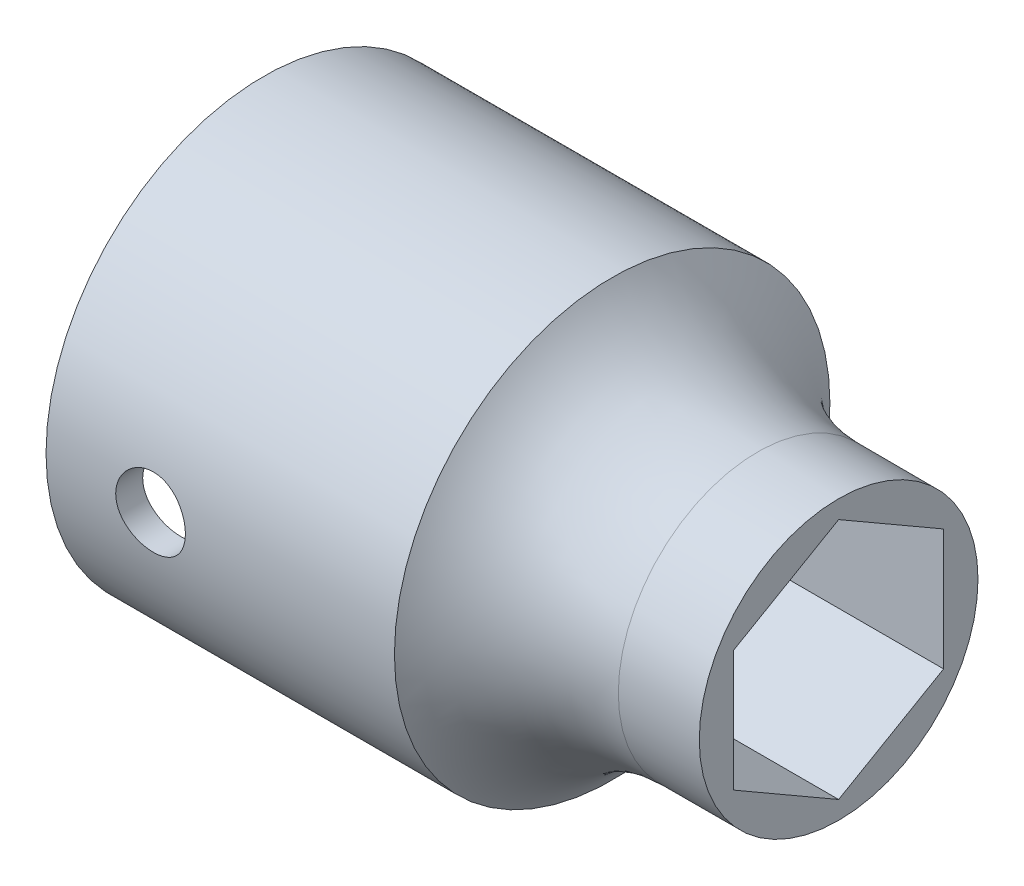
ISO-10303-21;
HEADER;
FILE_DESCRIPTION(('STEP AP214'),'2;1');
FILE_NAME('part.step','',(''),(''),'','','');
FILE_SCHEMA(('AUTOMOTIVE_DESIGN { 1 0 10303 214 1 1 1 1 }'));
ENDSEC;
DATA;
#1=APPLICATION_CONTEXT('core data for automotive mechanical design processes');
#2=APPLICATION_PROTOCOL_DEFINITION('international standard','automotive_design',2000,#1);
#3=PRODUCT_CONTEXT('',#1,'mechanical');
#4=PRODUCT('Part','Part','',(#3));
#5=PRODUCT_RELATED_PRODUCT_CATEGORY('part','',(#4));
#6=PRODUCT_DEFINITION_FORMATION('','',#4);
#7=PRODUCT_DEFINITION_CONTEXT('part definition',#1,'design');
#8=PRODUCT_DEFINITION('design','',#6,#7);
#9=PRODUCT_DEFINITION_SHAPE('','',#8);
#10=(LENGTH_UNIT() NAMED_UNIT(*) SI_UNIT(.MILLI.,.METRE.));
#11=(NAMED_UNIT(*) PLANE_ANGLE_UNIT() SI_UNIT($,.RADIAN.));
#12=(NAMED_UNIT(*) SI_UNIT($,.STERADIAN.) SOLID_ANGLE_UNIT());
#13=UNCERTAINTY_MEASURE_WITH_UNIT(LENGTH_MEASURE(1.E-05),#10,'distance_accuracy_value','');
#14=(GEOMETRIC_REPRESENTATION_CONTEXT(3) GLOBAL_UNCERTAINTY_ASSIGNED_CONTEXT((#13)) GLOBAL_UNIT_ASSIGNED_CONTEXT((#10,
#11,#12)) REPRESENTATION_CONTEXT('',''));
#15=CARTESIAN_POINT('',(0.,0.,0.));
#16=DIRECTION('',(0.,0.,1.));
#17=DIRECTION('',(1.,0.,0.));
#18=AXIS2_PLACEMENT_3D('',#15,#16,#17);
#19=CARTESIAN_POINT('',(30.,0.,0.));
#20=DIRECTION('',(-1.,0.,0.));
#21=DIRECTION('',(0.,0.,1.));
#22=AXIS2_PLACEMENT_3D('',#19,#20,#21);
#23=CYLINDRICAL_SURFACE('',#22,8.);
#24=CARTESIAN_POINT('',(28.351646544245,0.,0.));
#25=DIRECTION('',(-1.,0.,0.));
#26=DIRECTION('',(0.,0.,1.));
#27=AXIS2_PLACEMENT_3D('',#24,#25,#26);
#28=CIRCLE('',#27,8.);
#29=CARTESIAN_POINT('',(28.351646544245,0.,8.));
#30=VERTEX_POINT('',#29);
#31=EDGE_CURVE('E12',#30,#30,#28,.F.);
#32=ORIENTED_EDGE('',*,*,#31,.T.);
#33=EDGE_LOOP('',(#32));
#34=FACE_BOUND('',#33,.T.);
#35=CARTESIAN_POINT('',(33.,0.,0.));
#36=DIRECTION('',(1.,0.,0.));
#37=DIRECTION('',(0.,0.,-1.));
#38=AXIS2_PLACEMENT_3D('',#35,#36,#37);
#39=CIRCLE('',#38,8.);
#40=CARTESIAN_POINT('',(33.,0.,-8.));
#41=VERTEX_POINT('',#40);
#42=EDGE_CURVE('E122',#41,#41,#39,.T.);
#43=ORIENTED_EDGE('',*,*,#42,.F.);
#44=EDGE_LOOP('',(#43));
#45=FACE_BOUND('',#44,.T.);
#46=ADVANCED_FACE('F40',(#34,#45),#23,.T.);
#47=CARTESIAN_POINT('',(21.5,-3.4785353718675,6.025));
#48=DIRECTION('',(0.,-0.866025403784439,0.5));
#49=DIRECTION('',(0.,-0.5,-0.866025403784439));
#50=AXIS2_PLACEMENT_3D('',#47,#48,#49);
#51=PLANE('',#50);
#52=DIRECTION('',(1.,0.,0.));
#53=VECTOR('',#52,1.);
#54=CARTESIAN_POINT('',(21.5,-3.4785353718675,6.025));
#55=LINE('',#54,#53);
#56=CARTESIAN_POINT('',(21.5,-3.4785353718675,6.025));
#57=VERTEX_POINT('',#56);
#58=CARTESIAN_POINT('',(33.,-3.4785353718675,6.025));
#59=VERTEX_POINT('',#58);
#60=EDGE_CURVE('E48',#57,#59,#55,.T.);
#61=ORIENTED_EDGE('',*,*,#60,.T.);
#62=DIRECTION('',(0.,-0.5,-0.866025403784439));
#63=VECTOR('',#62,1.);
#64=CARTESIAN_POINT('',(33.,-3.4785353718675,6.025));
#65=LINE('',#64,#63);
#66=CARTESIAN_POINT('',(33.,-6.95707074373499,0.));
#67=VERTEX_POINT('',#66);
#68=EDGE_CURVE('E95',#59,#67,#65,.T.);
#69=ORIENTED_EDGE('',*,*,#68,.T.);
#70=DIRECTION('',(1.,0.,0.));
#71=VECTOR('',#70,1.);
#72=CARTESIAN_POINT('',(21.5,-6.95707074373499,0.));
#73=LINE('',#72,#71);
#74=CARTESIAN_POINT('',(21.5,-6.95707074373499,0.));
#75=VERTEX_POINT('',#74);
#76=EDGE_CURVE('E240',#75,#67,#73,.T.);
#77=ORIENTED_EDGE('',*,*,#76,.F.);
#78=DIRECTION('',(0.,-0.5,-0.866025403784439));
#79=VECTOR('',#78,1.);
#80=CARTESIAN_POINT('',(21.5,-3.4785353718675,6.025));
#81=LINE('',#80,#79);
#82=EDGE_CURVE('E98',#57,#75,#81,.T.);
#83=ORIENTED_EDGE('',*,*,#82,.F.);
#84=EDGE_LOOP('',(#61,#69,#77,#83));
#85=FACE_BOUND('',#84,.T.);
#86=ADVANCED_FACE('F93',(#85),#51,.F.);
#87=CARTESIAN_POINT('',(21.5,3.4785353718675,6.025));
#88=DIRECTION('',(0.,0.,1.));
#89=DIRECTION('',(0.,-1.,0.));
#90=AXIS2_PLACEMENT_3D('',#87,#88,#89);
#91=PLANE('',#90);
#92=DIRECTION('',(1.,0.,0.));
#93=VECTOR('',#92,1.);
#94=CARTESIAN_POINT('',(21.5,3.4785353718675,6.025));
#95=LINE('',#94,#93);
#96=CARTESIAN_POINT('',(21.5,3.4785353718675,6.025));
#97=VERTEX_POINT('',#96);
#98=CARTESIAN_POINT('',(33.,3.4785353718675,6.025));
#99=VERTEX_POINT('',#98);
#100=EDGE_CURVE('E62',#97,#99,#95,.T.);
#101=ORIENTED_EDGE('',*,*,#100,.T.);
#102=DIRECTION('',(0.,-1.,0.));
#103=VECTOR('',#102,1.);
#104=CARTESIAN_POINT('',(33.,3.4785353718675,6.025));
#105=LINE('',#104,#103);
#106=EDGE_CURVE('E102',#99,#59,#105,.T.);
#107=ORIENTED_EDGE('',*,*,#106,.T.);
#108=ORIENTED_EDGE('',*,*,#60,.F.);
#109=DIRECTION('',(0.,-1.,0.));
#110=VECTOR('',#109,1.);
#111=CARTESIAN_POINT('',(21.5,3.4785353718675,6.025));
#112=LINE('',#111,#110);
#113=EDGE_CURVE('E224',#97,#57,#112,.T.);
#114=ORIENTED_EDGE('',*,*,#113,.F.);
#115=EDGE_LOOP('',(#101,#107,#108,#114));
#116=FACE_BOUND('',#115,.T.);
#117=ADVANCED_FACE('F103',(#116),#91,.F.);
#118=CARTESIAN_POINT('',(21.5,6.95707074373499,0.));
#119=DIRECTION('',(0.,0.866025403784439,0.5));
#120=DIRECTION('',(0.,-0.5,0.866025403784439));
#121=AXIS2_PLACEMENT_3D('',#118,#119,#120);
#122=PLANE('',#121);
#123=DIRECTION('',(1.,0.,0.));
#124=VECTOR('',#123,1.);
#125=CARTESIAN_POINT('',(21.5,6.95707074373499,0.));
#126=LINE('',#125,#124);
#127=CARTESIAN_POINT('',(21.5,6.95707074373499,0.));
#128=VERTEX_POINT('',#127);
#129=CARTESIAN_POINT('',(33.,6.95707074373499,0.));
#130=VERTEX_POINT('',#129);
#131=EDGE_CURVE('E243',#128,#130,#126,.T.);
#132=ORIENTED_EDGE('',*,*,#131,.T.);
#133=DIRECTION('',(0.,-0.5,0.866025403784439));
#134=VECTOR('',#133,1.);
#135=CARTESIAN_POINT('',(33.,6.95707074373499,0.));
#136=LINE('',#135,#134);
#137=EDGE_CURVE('E120',#130,#99,#136,.T.);
#138=ORIENTED_EDGE('',*,*,#137,.T.);
#139=ORIENTED_EDGE('',*,*,#100,.F.);
#140=DIRECTION('',(0.,-0.5,0.866025403784439));
#141=VECTOR('',#140,1.);
#142=CARTESIAN_POINT('',(21.5,6.95707074373499,0.));
#143=LINE('',#142,#141);
#144=EDGE_CURVE('E238',#128,#97,#143,.T.);
#145=ORIENTED_EDGE('',*,*,#144,.F.);
#146=EDGE_LOOP('',(#132,#138,#139,#145));
#147=FACE_BOUND('',#146,.T.);
#148=ADVANCED_FACE('F206',(#147),#122,.F.);
#149=CARTESIAN_POINT('',(21.5,3.4785353718675,-6.025));
#150=DIRECTION('',(0.,0.866025403784439,-0.5));
#151=DIRECTION('',(0.,0.5,0.866025403784439));
#152=AXIS2_PLACEMENT_3D('',#149,#150,#151);
#153=PLANE('',#152);
#154=DIRECTION('',(1.,0.,0.));
#155=VECTOR('',#154,1.);
#156=CARTESIAN_POINT('',(21.5,3.4785353718675,-6.025));
#157=LINE('',#156,#155);
#158=CARTESIAN_POINT('',(21.5,3.4785353718675,-6.025));
#159=VERTEX_POINT('',#158);
#160=CARTESIAN_POINT('',(33.,3.4785353718675,-6.025));
#161=VERTEX_POINT('',#160);
#162=EDGE_CURVE('E245',#159,#161,#157,.T.);
#163=ORIENTED_EDGE('',*,*,#162,.T.);
#164=DIRECTION('',(0.,0.5,0.866025403784439));
#165=VECTOR('',#164,1.);
#166=CARTESIAN_POINT('',(33.,3.4785353718675,-6.025));
#167=LINE('',#166,#165);
#168=EDGE_CURVE('E117',#161,#130,#167,.T.);
#169=ORIENTED_EDGE('',*,*,#168,.T.);
#170=ORIENTED_EDGE('',*,*,#131,.F.);
#171=DIRECTION('',(0.,0.5,0.866025403784439));
#172=VECTOR('',#171,1.);
#173=CARTESIAN_POINT('',(21.5,3.4785353718675,-6.025));
#174=LINE('',#173,#172);
#175=EDGE_CURVE('E235',#159,#128,#174,.T.);
#176=ORIENTED_EDGE('',*,*,#175,.F.);
#177=EDGE_LOOP('',(#163,#169,#170,#176));
#178=FACE_BOUND('',#177,.T.);
#179=ADVANCED_FACE('F202',(#178),#153,.F.);
#180=CARTESIAN_POINT('',(21.5,-3.4785353718675,-6.025));
#181=DIRECTION('',(0.,0.,-1.));
#182=DIRECTION('',(0.,1.,0.));
#183=AXIS2_PLACEMENT_3D('',#180,#181,#182);
#184=PLANE('',#183);
#185=DIRECTION('',(1.,0.,0.));
#186=VECTOR('',#185,1.);
#187=CARTESIAN_POINT('',(21.5,-3.4785353718675,-6.025));
#188=LINE('',#187,#186);
#189=CARTESIAN_POINT('',(21.5,-3.4785353718675,-6.025));
#190=VERTEX_POINT('',#189);
#191=CARTESIAN_POINT('',(33.,-3.4785353718675,-6.025));
#192=VERTEX_POINT('',#191);
#193=EDGE_CURVE('E247',#190,#192,#188,.T.);
#194=ORIENTED_EDGE('',*,*,#193,.T.);
#195=DIRECTION('',(0.,1.,0.));
#196=VECTOR('',#195,1.);
#197=CARTESIAN_POINT('',(33.,-3.4785353718675,-6.025));
#198=LINE('',#197,#196);
#199=EDGE_CURVE('E112',#192,#161,#198,.T.);
#200=ORIENTED_EDGE('',*,*,#199,.T.);
#201=ORIENTED_EDGE('',*,*,#162,.F.);
#202=DIRECTION('',(0.,1.,0.));
#203=VECTOR('',#202,1.);
#204=CARTESIAN_POINT('',(21.5,-3.4785353718675,-6.025));
#205=LINE('',#204,#203);
#206=EDGE_CURVE('E227',#190,#159,#205,.T.);
#207=ORIENTED_EDGE('',*,*,#206,.F.);
#208=EDGE_LOOP('',(#194,#200,#201,#207));
#209=FACE_BOUND('',#208,.T.);
#210=ADVANCED_FACE('F198',(#209),#184,.F.);
#211=CARTESIAN_POINT('',(21.5,-6.95707074373499,0.));
#212=DIRECTION('',(0.,-0.866025403784439,-0.5));
#213=DIRECTION('',(0.,0.5,-0.866025403784439));
#214=AXIS2_PLACEMENT_3D('',#211,#212,#213);
#215=PLANE('',#214);
#216=ORIENTED_EDGE('',*,*,#76,.T.);
#217=DIRECTION('',(0.,0.5,-0.866025403784439));
#218=VECTOR('',#217,1.);
#219=CARTESIAN_POINT('',(33.,-6.95707074373499,0.));
#220=LINE('',#219,#218);
#221=EDGE_CURVE('E110',#67,#192,#220,.T.);
#222=ORIENTED_EDGE('',*,*,#221,.T.);
#223=ORIENTED_EDGE('',*,*,#193,.F.);
#224=DIRECTION('',(0.,0.5,-0.866025403784439));
#225=VECTOR('',#224,1.);
#226=CARTESIAN_POINT('',(21.5,-6.95707074373499,0.));
#227=LINE('',#226,#225);
#228=EDGE_CURVE('E223',#75,#190,#227,.T.);
#229=ORIENTED_EDGE('',*,*,#228,.F.);
#230=EDGE_LOOP('',(#216,#222,#223,#229));
#231=FACE_BOUND('',#230,.T.);
#232=ADVANCED_FACE('F194',(#231),#215,.F.);
#233=CARTESIAN_POINT('',(21.5,0.,0.));
#234=DIRECTION('',(1.,0.,0.));
#235=DIRECTION('',(0.,0.,-1.));
#236=AXIS2_PLACEMENT_3D('',#233,#234,#235);
#237=PLANE('',#236);
#238=CARTESIAN_POINT('',(21.5,0.,0.));
#239=DIRECTION('',(1.,0.,0.));
#240=DIRECTION('',(0.,0.,-1.));
#241=AXIS2_PLACEMENT_3D('',#238,#239,#240);
#242=CIRCLE('',#241,2.025);
#243=CARTESIAN_POINT('',(21.5,0.,-2.025));
#244=VERTEX_POINT('',#243);
#245=EDGE_CURVE('E219',#244,#244,#242,.F.);
#246=ORIENTED_EDGE('',*,*,#245,.T.);
#247=EDGE_LOOP('',(#246));
#248=FACE_BOUND('',#247,.T.);
#249=ORIENTED_EDGE('',*,*,#82,.T.);
#250=ORIENTED_EDGE('',*,*,#228,.T.);
#251=ORIENTED_EDGE('',*,*,#206,.T.);
#252=ORIENTED_EDGE('',*,*,#175,.T.);
#253=ORIENTED_EDGE('',*,*,#144,.T.);
#254=ORIENTED_EDGE('',*,*,#113,.T.);
#255=EDGE_LOOP('',(#249,#250,#251,#252,#253,#254));
#256=FACE_BOUND('',#255,.T.);
#257=ADVANCED_FACE('F197',(#248,#256),#237,.T.);
#258=CARTESIAN_POINT('',(20.,0.,0.));
#259=DIRECTION('',(-1.,0.,0.));
#260=DIRECTION('',(0.,0.,1.));
#261=AXIS2_PLACEMENT_3D('',#258,#259,#260);
#262=CYLINDRICAL_SURFACE('',#261,12.5);
#263=CARTESIAN_POINT('',(8.,0.,-12.5));
#264=CARTESIAN_POINT('',(7.99999547136982,-0.111577020127934,-12.4999981342099));
#265=CARTESIAN_POINT('',(7.99063139270684,-0.223216523860334,-12.4984904676373));
#266=CARTESIAN_POINT('',(7.95343555230202,-0.443368779658238,-12.4926212341856));
#267=CARTESIAN_POINT('',(7.92558639609986,-0.551878486135173,-12.4882569793104));
#268=CARTESIAN_POINT('',(7.85227911955399,-0.762553771126288,-12.4771644640129));
#269=CARTESIAN_POINT('',(7.80683495387921,-0.864724302944006,-12.4704380773984));
#270=CARTESIAN_POINT('',(7.69966320560222,-1.05997584434546,-12.4553623980115));
#271=CARTESIAN_POINT('',(7.63793764911637,-1.15305798294893,-12.4470133072085));
#272=CARTESIAN_POINT('',(7.49937439573757,-1.32832749604674,-12.4295364290338));
#273=CARTESIAN_POINT('',(7.42242102105483,-1.41042286652597,-12.4204030044304));
#274=CARTESIAN_POINT('',(7.25583553272503,-1.56059410283783,-12.4024303990938));
#275=CARTESIAN_POINT('',(7.16620264933132,-1.62866911690709,-12.393591236265));
#276=CARTESIAN_POINT('',(6.97617611384793,-1.74923165413214,-12.377153335782));
#277=CARTESIAN_POINT('',(6.87572456263839,-1.80162899846096,-12.369561883485));
#278=CARTESIAN_POINT('',(6.66730433713119,-1.88877230962607,-12.3565566594955));
#279=CARTESIAN_POINT('',(6.55933613036253,-1.92351937318009,-12.3511427525034));
#280=CARTESIAN_POINT('',(6.33991962313518,-1.97408758681328,-12.3431614474236));
#281=CARTESIAN_POINT('',(6.22850868904997,-1.990067044504,-12.3405702530036));
#282=CARTESIAN_POINT('',(6.00455901291456,-2.00313711337577,-12.3384556715911));
#283=CARTESIAN_POINT('',(5.89202034492549,-2.00022895694192,-12.3389320844424));
#284=CARTESIAN_POINT('',(5.67013496950106,-1.97573547058134,-12.3428771480604));
#285=CARTESIAN_POINT('',(5.56076812263896,-1.95432734726414,-12.3463174079177));
#286=CARTESIAN_POINT('',(5.34719892890204,-1.8937194351384,-12.3557581320174));
#287=CARTESIAN_POINT('',(5.2429967465491,-1.85451907995672,-12.36175867776));
#288=CARTESIAN_POINT('',(5.04218073214415,-1.75925788747206,-12.375674818266));
#289=CARTESIAN_POINT('',(4.94560270031462,-1.70312285817509,-12.3835988093069));
#290=CARTESIAN_POINT('',(4.76316972831466,-1.57563852632363,-12.4004630811492));
#291=CARTESIAN_POINT('',(4.67731558787681,-1.50428809015537,-12.4094034376511));
#292=CARTESIAN_POINT('',(4.51774119956266,-1.34742984087892,-12.4274181245254));
#293=CARTESIAN_POINT('',(4.44417049293121,-1.26176985545599,-12.4364928200271));
#294=CARTESIAN_POINT('',(4.31242526115699,-1.07924037468052,-12.4536592708467));
#295=CARTESIAN_POINT('',(4.25425082132993,-0.982370817216379,-12.4617510207175));
#296=CARTESIAN_POINT('',(4.15493832188602,-0.780035888309119,-12.4760500569944));
#297=CARTESIAN_POINT('',(4.11381278273113,-0.674564267421531,-12.4822559575706));
#298=CARTESIAN_POINT('',(4.04990064207399,-0.45808983393977,-12.492072755936));
#299=CARTESIAN_POINT('',(4.02711262806293,-0.34708744807073,-12.4956838535962));
#300=CARTESIAN_POINT('',(4.00072352998704,-0.123992055401969,-12.4998774645506));
#301=CARTESIAN_POINT('',(3.99691703404234,-0.011923933660437,-12.5004923996757));
#302=CARTESIAN_POINT('',(4.00805238160926,0.211249371511144,-12.4987129750933));
#303=CARTESIAN_POINT('',(4.02299356211135,0.322354588854289,-12.4963187218055));
#304=CARTESIAN_POINT('',(4.07102929818924,0.539818798235508,-12.4888100015234));
#305=CARTESIAN_POINT('',(4.10402282530455,0.646200674402083,-12.4837106780256));
#306=CARTESIAN_POINT('',(4.18711946853005,0.851922990585996,-12.4713614614776));
#307=CARTESIAN_POINT('',(4.2372234819381,0.951263060991192,-12.4641114556453));
#308=CARTESIAN_POINT('',(4.35359399930331,1.14097865112887,-12.4481852151843));
#309=CARTESIAN_POINT('',(4.41998963602307,1.2312740030957,-12.4394977755831));
#310=CARTESIAN_POINT('',(4.56688015436251,1.39951415639528,-12.4216959541371));
#311=CARTESIAN_POINT('',(4.64737597512825,1.47745813440283,-12.4125815438834));
#312=CARTESIAN_POINT('',(4.82110038810396,1.61953866530001,-12.3948490273074));
#313=CARTESIAN_POINT('',(4.91444277878682,1.6835368741472,-12.3862364645378));
#314=CARTESIAN_POINT('',(5.11067378112034,1.7949448921012,-12.3705841030174));
#315=CARTESIAN_POINT('',(5.2135621077771,1.84235519623835,-12.3635442573346));
#316=CARTESIAN_POINT('',(5.42556695921822,1.91903158354154,-12.3518754120478));
#317=CARTESIAN_POINT('',(5.53465745459787,1.94836814902516,-12.3472370587722));
#318=CARTESIAN_POINT('',(5.75629756999202,1.9882871855446,-12.3408723222072));
#319=CARTESIAN_POINT('',(5.86884691429084,1.99887114748454,-12.3391457074239));
#320=CARTESIAN_POINT('',(6.09282949343662,2.00094546618394,-12.3388093758569));
#321=CARTESIAN_POINT('',(6.20426071953976,1.99265347821446,-12.3401641282165));
#322=CARTESIAN_POINT('',(6.42412132262723,1.95768017972975,-12.3457602825821));
#323=CARTESIAN_POINT('',(6.53255070721189,1.93099891577862,-12.3500016772787));
#324=CARTESIAN_POINT('',(6.74325535001647,1.86008521855063,-12.3608801586201));
#325=CARTESIAN_POINT('',(6.84553655764132,1.81587007770134,-12.3675148843103));
#326=CARTESIAN_POINT('',(7.04126446767307,1.71116577284244,-12.3824349767408));
#327=CARTESIAN_POINT('',(7.13471078843823,1.65067590624507,-12.3907204147391));
#328=CARTESIAN_POINT('',(7.31121858083654,1.51435663599677,-12.4081216807701));
#329=CARTESIAN_POINT('',(7.39415524790042,1.43836664580959,-12.417245602178));
#330=CARTESIAN_POINT('',(7.54617538139752,1.27354334357953,-12.4352300129975));
#331=CARTESIAN_POINT('',(7.61525563814871,1.18470706402004,-12.44409044097));
#332=CARTESIAN_POINT('',(7.73799746617181,0.996048346577333,-12.4606140562915));
#333=CARTESIAN_POINT('',(7.7915588738874,0.896160049794846,-12.4682693265296));
#334=CARTESIAN_POINT('',(7.88106129289908,0.688725166968655,-12.4814428750468));
#335=CARTESIAN_POINT('',(7.91702014310397,0.581186461209753,-12.4869633156233));
#336=CARTESIAN_POINT('',(7.96234573873548,0.394335518838039,-12.4940175589639));
#337=CARTESIAN_POINT('',(7.9764439027928,0.316163477498691,-12.4962491778317));
#338=CARTESIAN_POINT('',(7.99527257286361,0.158671480151703,-12.4992410506714));
#339=CARTESIAN_POINT('',(8.00000322067918,0.0793515415388269,-12.5000013269159));
#340=CARTESIAN_POINT('',(8.,0.,-12.5));
#341=B_SPLINE_CURVE_WITH_KNOTS('',3,(#263,#264,#265,#266,#267,#268,#269,#270,#271,#272,#273,
#274,#275,#276,#277,#278,#279,#280,#281,#282,#283,#284,#285,#286,#287,#288,#289,#290,#291,#292,
#293,#294,#295,#296,#297,#298,#299,#300,#301,#302,#303,#304,#305,#306,#307,#308,#309,#310,#311,
#312,#313,#314,#315,#316,#317,#318,#319,#320,#321,#322,#323,#324,#325,#326,#327,#328,#329,#330,
#331,#332,#333,#334,#335,#336,#337,#338,#339,#340),.UNSPECIFIED.,.T.,.F.,(4,2,2,2,2,2,2,2,2,2,2,
2,2,2,2,2,2,2,2,2,2,2,2,2,2,2,2,2,2,2,2,2,2,2,2,2,2,2,4),(0.,0.334441046622944,
0.669197249319467,1.00368849765685,1.33813814029104,1.67523334608234,2.0123490250128,
2.35136809625945,2.69036609964137,3.0264835846965,3.36257913887026,3.695490558905,
4.02841257712192,4.36281487068318,4.69724208737484,5.0354831333739,5.37372605363721,
5.71221693636019,6.05068174320194,6.38547572150114,6.72025786018134,7.05318530227047,
7.38613020622256,7.72180459283844,8.0575013456327,8.39639027086604,8.7352690818252,
9.07281785760314,9.41033979575026,9.74398956846141,10.0776384963298,10.4109591848676,
10.7442942653298,11.0812763085405,11.4183363199473,11.7575256865024,12.0963705940352,
12.3342225666998,12.5720709388195),.UNSPECIFIED.);
#342=CARTESIAN_POINT('',(8.,0.,-12.5));
#343=VERTEX_POINT('',#342);
#344=EDGE_CURVE('E134',#343,#343,#341,.T.);
#345=ORIENTED_EDGE('',*,*,#344,.F.);
#346=EDGE_LOOP('',(#345));
#347=FACE_BOUND('',#346,.T.);
#348=CARTESIAN_POINT('',(8.,0.,12.5));
#349=CARTESIAN_POINT('',(7.99999547136982,0.111577020127934,12.4999981342099));
#350=CARTESIAN_POINT('',(7.99063139270684,0.223216523860334,12.4984904676373));
#351=CARTESIAN_POINT('',(7.95343555230202,0.443368779658238,12.4926212341856));
#352=CARTESIAN_POINT('',(7.92558639609986,0.551878486135173,12.4882569793104));
#353=CARTESIAN_POINT('',(7.85227911955399,0.762553771126288,12.4771644640129));
#354=CARTESIAN_POINT('',(7.80683495387921,0.864724302944006,12.4704380773984));
#355=CARTESIAN_POINT('',(7.69966320560222,1.05997584434546,12.4553623980115));
#356=CARTESIAN_POINT('',(7.63793764911637,1.15305798294893,12.4470133072085));
#357=CARTESIAN_POINT('',(7.49937439573757,1.32832749604674,12.4295364290338));
#358=CARTESIAN_POINT('',(7.42242102105483,1.41042286652597,12.4204030044304));
#359=CARTESIAN_POINT('',(7.25583553272503,1.56059410283783,12.4024303990938));
#360=CARTESIAN_POINT('',(7.16620264933132,1.62866911690709,12.393591236265));
#361=CARTESIAN_POINT('',(6.97617611384793,1.74923165413214,12.377153335782));
#362=CARTESIAN_POINT('',(6.87572456263839,1.80162899846096,12.369561883485));
#363=CARTESIAN_POINT('',(6.66730433713119,1.88877230962607,12.3565566594955));
#364=CARTESIAN_POINT('',(6.55933613036253,1.92351937318009,12.3511427525034));
#365=CARTESIAN_POINT('',(6.33991962313518,1.97408758681328,12.3431614474236));
#366=CARTESIAN_POINT('',(6.22850868904997,1.990067044504,12.3405702530036));
#367=CARTESIAN_POINT('',(6.00455901291456,2.00313711337577,12.3384556715911));
#368=CARTESIAN_POINT('',(5.89202034492549,2.00022895694192,12.3389320844424));
#369=CARTESIAN_POINT('',(5.67013496950106,1.97573547058134,12.3428771480604));
#370=CARTESIAN_POINT('',(5.56076812263896,1.95432734726414,12.3463174079177));
#371=CARTESIAN_POINT('',(5.34719892890204,1.8937194351384,12.3557581320174));
#372=CARTESIAN_POINT('',(5.2429967465491,1.85451907995672,12.36175867776));
#373=CARTESIAN_POINT('',(5.04218073214415,1.75925788747206,12.375674818266));
#374=CARTESIAN_POINT('',(4.94560270031462,1.70312285817509,12.3835988093069));
#375=CARTESIAN_POINT('',(4.76316972831466,1.57563852632363,12.4004630811492));
#376=CARTESIAN_POINT('',(4.67731558787681,1.50428809015537,12.4094034376511));
#377=CARTESIAN_POINT('',(4.51774119956266,1.34742984087892,12.4274181245254));
#378=CARTESIAN_POINT('',(4.44417049293121,1.26176985545599,12.4364928200271));
#379=CARTESIAN_POINT('',(4.31242526115699,1.07924037468052,12.4536592708467));
#380=CARTESIAN_POINT('',(4.25425082132993,0.982370817216379,12.4617510207175));
#381=CARTESIAN_POINT('',(4.15493832188602,0.780035888309119,12.4760500569944));
#382=CARTESIAN_POINT('',(4.11381278273113,0.674564267421531,12.4822559575706));
#383=CARTESIAN_POINT('',(4.04990064207399,0.45808983393977,12.492072755936));
#384=CARTESIAN_POINT('',(4.02711262806293,0.34708744807073,12.4956838535962));
#385=CARTESIAN_POINT('',(4.00072352998704,0.123992055401969,12.4998774645506));
#386=CARTESIAN_POINT('',(3.99691703404234,0.011923933660437,12.5004923996757));
#387=CARTESIAN_POINT('',(4.00805238160926,-0.211249371511144,12.4987129750933));
#388=CARTESIAN_POINT('',(4.02299356211135,-0.322354588854289,12.4963187218055));
#389=CARTESIAN_POINT('',(4.07102929818924,-0.539818798235508,12.4888100015234));
#390=CARTESIAN_POINT('',(4.10402282530455,-0.646200674402083,12.4837106780256));
#391=CARTESIAN_POINT('',(4.18711946853005,-0.851922990585996,12.4713614614776));
#392=CARTESIAN_POINT('',(4.2372234819381,-0.951263060991192,12.4641114556453));
#393=CARTESIAN_POINT('',(4.35359399930331,-1.14097865112887,12.4481852151843));
#394=CARTESIAN_POINT('',(4.41998963602307,-1.2312740030957,12.4394977755831));
#395=CARTESIAN_POINT('',(4.56688015436251,-1.39951415639528,12.4216959541371));
#396=CARTESIAN_POINT('',(4.64737597512825,-1.47745813440283,12.4125815438834));
#397=CARTESIAN_POINT('',(4.82110038810396,-1.61953866530001,12.3948490273074));
#398=CARTESIAN_POINT('',(4.91444277878682,-1.6835368741472,12.3862364645378));
#399=CARTESIAN_POINT('',(5.11067378112034,-1.7949448921012,12.3705841030174));
#400=CARTESIAN_POINT('',(5.2135621077771,-1.84235519623835,12.3635442573346));
#401=CARTESIAN_POINT('',(5.42556695921822,-1.91903158354154,12.3518754120478));
#402=CARTESIAN_POINT('',(5.53465745459787,-1.94836814902516,12.3472370587722));
#403=CARTESIAN_POINT('',(5.75629756999202,-1.9882871855446,12.3408723222072));
#404=CARTESIAN_POINT('',(5.86884691429084,-1.99887114748454,12.3391457074239));
#405=CARTESIAN_POINT('',(6.09282949343662,-2.00094546618394,12.3388093758569));
#406=CARTESIAN_POINT('',(6.20426071953976,-1.99265347821446,12.3401641282165));
#407=CARTESIAN_POINT('',(6.42412132262723,-1.95768017972975,12.3457602825821));
#408=CARTESIAN_POINT('',(6.53255070721189,-1.93099891577862,12.3500016772787));
#409=CARTESIAN_POINT('',(6.74325535001647,-1.86008521855063,12.3608801586201));
#410=CARTESIAN_POINT('',(6.84553655764132,-1.81587007770134,12.3675148843103));
#411=CARTESIAN_POINT('',(7.04126446767307,-1.71116577284244,12.3824349767408));
#412=CARTESIAN_POINT('',(7.13471078843823,-1.65067590624507,12.3907204147391));
#413=CARTESIAN_POINT('',(7.31121858083654,-1.51435663599677,12.4081216807701));
#414=CARTESIAN_POINT('',(7.39415524790042,-1.43836664580959,12.417245602178));
#415=CARTESIAN_POINT('',(7.54617538139752,-1.27354334357953,12.4352300129975));
#416=CARTESIAN_POINT('',(7.61525563814871,-1.18470706402004,12.44409044097));
#417=CARTESIAN_POINT('',(7.73799746617181,-0.996048346577333,12.4606140562915));
#418=CARTESIAN_POINT('',(7.7915588738874,-0.896160049794846,12.4682693265296));
#419=CARTESIAN_POINT('',(7.88106129289908,-0.688725166968655,12.4814428750468));
#420=CARTESIAN_POINT('',(7.91702014310397,-0.581186461209753,12.4869633156233));
#421=CARTESIAN_POINT('',(7.96234573873548,-0.394335518838039,12.4940175589639));
#422=CARTESIAN_POINT('',(7.9764439027928,-0.316163477498691,12.4962491778317));
#423=CARTESIAN_POINT('',(7.99527257286361,-0.158671480151703,12.4992410506714));
#424=CARTESIAN_POINT('',(8.00000322067918,-0.0793515415388269,12.5000013269159));
#425=CARTESIAN_POINT('',(8.,0.,12.5));
#426=B_SPLINE_CURVE_WITH_KNOTS('',3,(#348,#349,#350,#351,#352,#353,#354,#355,#356,#357,#358,
#359,#360,#361,#362,#363,#364,#365,#366,#367,#368,#369,#370,#371,#372,#373,#374,#375,#376,#377,
#378,#379,#380,#381,#382,#383,#384,#385,#386,#387,#388,#389,#390,#391,#392,#393,#394,#395,#396,
#397,#398,#399,#400,#401,#402,#403,#404,#405,#406,#407,#408,#409,#410,#411,#412,#413,#414,#415,
#416,#417,#418,#419,#420,#421,#422,#423,#424,#425),.UNSPECIFIED.,.T.,.F.,(4,2,2,2,2,2,2,2,2,2,2,
2,2,2,2,2,2,2,2,2,2,2,2,2,2,2,2,2,2,2,2,2,2,2,2,2,2,2,4),(0.,0.334441046622944,
0.669197249319467,1.00368849765685,1.33813814029104,1.67523334608234,2.0123490250128,
2.35136809625945,2.69036609964137,3.0264835846965,3.36257913887026,3.695490558905,
4.02841257712192,4.36281487068318,4.69724208737484,5.0354831333739,5.37372605363721,
5.71221693636019,6.05068174320194,6.38547572150114,6.72025786018134,7.05318530227047,
7.38613020622256,7.72180459283844,8.0575013456327,8.39639027086604,8.7352690818252,
9.07281785760314,9.41033979575026,9.74398956846141,10.0776384963298,10.4109591848676,
10.7442942653298,11.0812763085405,11.4183363199473,11.7575256865024,12.0963705940352,
12.3342225666998,12.5720709388195),.UNSPECIFIED.);
#427=CARTESIAN_POINT('',(8.,0.,12.5));
#428=VERTEX_POINT('',#427);
#429=EDGE_CURVE('E126',#428,#428,#426,.T.);
#430=ORIENTED_EDGE('',*,*,#429,.F.);
#431=EDGE_LOOP('',(#430));
#432=FACE_BOUND('',#431,.T.);
#433=CARTESIAN_POINT('',(20.,0.,0.));
#434=DIRECTION('',(-1.,0.,0.));
#435=DIRECTION('',(0.,0.,1.));
#436=AXIS2_PLACEMENT_3D('',#433,#434,#435);
#437=CIRCLE('',#436,12.5);
#438=CARTESIAN_POINT('',(20.,0.,12.5));
#439=VERTEX_POINT('',#438);
#440=EDGE_CURVE('E225',#439,#439,#437,.T.);
#441=ORIENTED_EDGE('',*,*,#440,.T.);
#442=EDGE_LOOP('',(#441));
#443=FACE_BOUND('',#442,.T.);
#444=CARTESIAN_POINT('',(0.,0.,0.));
#445=DIRECTION('',(-1.,0.,0.));
#446=DIRECTION('',(0.,0.,1.));
#447=AXIS2_PLACEMENT_3D('',#444,#445,#446);
#448=CIRCLE('',#447,12.5);
#449=CARTESIAN_POINT('',(0.,0.,12.5));
#450=VERTEX_POINT('',#449);
#451=EDGE_CURVE('E230',#450,#450,#448,.T.);
#452=ORIENTED_EDGE('',*,*,#451,.F.);
#453=EDGE_LOOP('',(#452));
#454=FACE_BOUND('',#453,.T.);
#455=ADVANCED_FACE('F140',(#347,#432,#443,#454),#262,.T.);
#456=CARTESIAN_POINT('',(0.,0.,0.));
#457=DIRECTION('',(1.,0.,0.));
#458=DIRECTION('',(0.,0.,-1.));
#459=AXIS2_PLACEMENT_3D('',#456,#457,#458);
#460=PLANE('',#459);
#461=CARTESIAN_POINT('',(0.,0.,0.));
#462=DIRECTION('',(-1.,0.,0.));
#463=DIRECTION('',(0.,0.,1.));
#464=AXIS2_PLACEMENT_3D('',#461,#462,#463);
#465=CIRCLE('',#464,10.95);
#466=CARTESIAN_POINT('',(0.,0.,10.95));
#467=VERTEX_POINT('',#466);
#468=EDGE_CURVE('E254',#467,#467,#465,.T.);
#469=ORIENTED_EDGE('',*,*,#468,.F.);
#470=EDGE_LOOP('',(#469));
#471=FACE_BOUND('',#470,.T.);
#472=ORIENTED_EDGE('',*,*,#451,.T.);
#473=EDGE_LOOP('',(#472));
#474=FACE_BOUND('',#473,.T.);
#475=ADVANCED_FACE('F169',(#471,#474),#460,.F.);
#476=CARTESIAN_POINT('',(19.,0.,0.));
#477=DIRECTION('',(-1.,0.,0.));
#478=DIRECTION('',(0.,0.,1.));
#479=AXIS2_PLACEMENT_3D('',#476,#477,#478);
#480=CYLINDRICAL_SURFACE('',#479,10.95);
#481=CARTESIAN_POINT('',(8.,0.,10.95));
#482=CARTESIAN_POINT('',(7.99999569065161,0.111348381635928,10.9499980036553));
#483=CARTESIAN_POINT('',(7.990669732188,0.222753443115321,10.9482840065163));
#484=CARTESIAN_POINT('',(7.95363425177784,0.442427818560137,10.9416116976913));
#485=CARTESIAN_POINT('',(7.92590887678734,0.550694344315015,10.9366505883253));
#486=CARTESIAN_POINT('',(7.85294887951096,0.760882596695436,10.9240393808739));
#487=CARTESIAN_POINT('',(7.80772971058084,0.862809831226147,10.9163916565893));
#488=CARTESIAN_POINT('',(7.70110879482588,1.05762041808732,10.8992437376749));
#489=CARTESIAN_POINT('',(7.63970848810799,1.15050457423684,10.8897437079181));
#490=CARTESIAN_POINT('',(7.50172543076383,1.32566064593526,10.8698198640248));
#491=CARTESIAN_POINT('',(7.42499419450828,1.40781464147929,10.8593876150005));
#492=CARTESIAN_POINT('',(7.25884686940928,1.55815857886228,10.8388381849621));
#493=CARTESIAN_POINT('',(7.16942989807892,1.62634754841299,10.8287210259273));
#494=CARTESIAN_POINT('',(6.97962157014131,1.74731195740775,10.8098653870516));
#495=CARTESIAN_POINT('',(6.87915310510834,1.79996824932667,10.8011377894324));
#496=CARTESIAN_POINT('',(6.67061019392357,1.88761005050865,10.7861678854112));
#497=CARTESIAN_POINT('',(6.56253636955889,1.92259700244623,10.7799253761143));
#498=CARTESIAN_POINT('',(6.34310954946887,1.97353018027948,10.7707171411716));
#499=CARTESIAN_POINT('',(6.23180568543408,1.9896815686478,10.7677161352001));
#500=CARTESIAN_POINT('',(6.00803047007043,2.00312178474567,10.7652242450541));
#501=CARTESIAN_POINT('',(5.89555921884641,2.00041221669735,10.765733062351));
#502=CARTESIAN_POINT('',(5.67412290777678,1.9763739765055,10.7701711849814));
#503=CARTESIAN_POINT('',(5.5651316151005,1.9552779060627,10.7740577576834));
#504=CARTESIAN_POINT('',(5.35226178450254,1.89543150246239,10.7847464084123));
#505=CARTESIAN_POINT('',(5.24838345393478,1.8566804539676,10.7915486045727));
#506=CARTESIAN_POINT('',(5.04800387140748,1.7623946024027,10.8073471004507));
#507=CARTESIAN_POINT('',(4.95154812682064,1.70676523250928,10.8163557060761));
#508=CARTESIAN_POINT('',(4.76925247586159,1.58036879392574,10.8355437463309));
#509=CARTESIAN_POINT('',(4.68341359481176,1.50960026497173,10.8457232938609));
#510=CARTESIAN_POINT('',(4.52344379065739,1.35367705921726,10.8662928238887));
#511=CARTESIAN_POINT('',(4.44950691112057,1.26832327742145,10.876683678389));
#512=CARTESIAN_POINT('',(4.31697285860147,1.08632041545151,10.8963650994791));
#513=CARTESIAN_POINT('',(4.25837582488551,0.989671232740997,10.9056556560791));
#514=CARTESIAN_POINT('',(4.15815890593392,0.787623530979866,10.9221070168864));
#515=CARTESIAN_POINT('',(4.1165584625257,0.682215157446521,10.9292653796281));
#516=CARTESIAN_POINT('',(4.05170786152997,0.465746966161224,10.9406267775647));
#517=CARTESIAN_POINT('',(4.02845585568713,0.35468771882706,10.944830110418));
#518=CARTESIAN_POINT('',(4.00123054473587,0.131740504300685,10.9497671703655));
#519=CARTESIAN_POINT('',(3.99699124788339,0.0198860438011337,10.9505487645691));
#520=CARTESIAN_POINT('',(4.00719925433134,-0.202933735685016,10.9486862344575));
#521=CARTESIAN_POINT('',(4.02164568826471,-0.313899095795968,10.9460422695189));
#522=CARTESIAN_POINT('',(4.06859389549473,-0.530952448847206,10.9376554614358));
#523=CARTESIAN_POINT('',(4.10096178148228,-0.637070366859201,10.9319356066085));
#524=CARTESIAN_POINT('',(4.18268972644848,-0.842373408947656,10.9180357004149));
#525=CARTESIAN_POINT('',(4.23205089256083,-0.941558080807702,10.9098554887578));
#526=CARTESIAN_POINT('',(4.34695789577026,-1.13131925739251,10.8918229042578));
#527=CARTESIAN_POINT('',(4.41266714600631,-1.22179520550528,10.8819539829588));
#528=CARTESIAN_POINT('',(4.55818306589583,-1.39053164265765,10.8616829815624));
#529=CARTESIAN_POINT('',(4.63799098016767,-1.46879105208148,10.8512808544516));
#530=CARTESIAN_POINT('',(4.81064033764473,-1.61187766788993,10.8309579918424));
#531=CARTESIAN_POINT('',(4.90363292404823,-1.6765237753369,10.8210449457548));
#532=CARTESIAN_POINT('',(5.09931390550408,-1.78927752227362,10.8029746014201));
#533=CARTESIAN_POINT('',(5.20200195177185,-1.83738575640827,10.7948172400485));
#534=CARTESIAN_POINT('',(5.4136878615159,-1.91543792765914,10.7812415828378));
#535=CARTESIAN_POINT('',(5.52265362649872,-1.94546659765005,10.7758105299457));
#536=CARTESIAN_POINT('',(5.74419175095795,-1.98676995424679,10.7682725495025));
#537=CARTESIAN_POINT('',(5.85676372530289,-1.99804663674337,10.766165268183));
#538=CARTESIAN_POINT('',(6.08050618859883,-2.00146180373377,10.7655307238168));
#539=CARTESIAN_POINT('',(6.19167226917281,-1.99388579133266,10.7669500536699));
#540=CARTESIAN_POINT('',(6.41111829247234,-1.96043381370678,10.7730907190184));
#541=CARTESIAN_POINT('',(6.51939825038506,-1.93455794479803,10.7778120371346));
#542=CARTESIAN_POINT('',(6.72985523764884,-1.86535860049343,10.7900027406122));
#543=CARTESIAN_POINT('',(6.83204221457041,-1.82206451090257,10.79746749577));
#544=CARTESIAN_POINT('',(7.02774796808534,-1.71928840525777,10.8143075247375));
#545=CARTESIAN_POINT('',(7.12126617526081,-1.65980532682059,10.8236829239209));
#546=CARTESIAN_POINT('',(7.29841294068059,-1.52534073543676,10.843454522407));
#547=CARTESIAN_POINT('',(7.38188196751536,-1.45015087325334,10.8538633411281));
#548=CARTESIAN_POINT('',(7.53511393397701,-1.2868428992934,10.8744330735172));
#549=CARTESIAN_POINT('',(7.60487371884881,-1.19872181992998,10.8845939296543));
#550=CARTESIAN_POINT('',(7.7292569038279,-1.01115915743809,10.9036236788774));
#551=CARTESIAN_POINT('',(7.78374696015377,-0.911627930850781,10.9124808880669));
#552=CARTESIAN_POINT('',(7.87514591261552,-0.704695979099886,10.9277914798167));
#553=CARTESIAN_POINT('',(7.91207156652739,-0.597302868136249,10.9342471523387));
#554=CARTESIAN_POINT('',(7.95966929515884,-0.407973526953254,10.942688438166));
#555=CARTESIAN_POINT('',(7.97476786416934,-0.327154094175092,10.9454149934538));
#556=CARTESIAN_POINT('',(7.9949346892943,-0.164233367042646,10.949071489749));
#557=CARTESIAN_POINT('',(8.00000317863483,-0.0821321025391062,10.9500014725314));
#558=CARTESIAN_POINT('',(8.,0.,10.95));
#559=B_SPLINE_CURVE_WITH_KNOTS('',3,(#481,#482,#483,#484,#485,#486,#487,#488,#489,#490,#491,
#492,#493,#494,#495,#496,#497,#498,#499,#500,#501,#502,#503,#504,#505,#506,#507,#508,#509,#510,
#511,#512,#513,#514,#515,#516,#517,#518,#519,#520,#521,#522,#523,#524,#525,#526,#527,#528,#529,
#530,#531,#532,#533,#534,#535,#536,#537,#538,#539,#540,#541,#542,#543,#544,#545,#546,#547,#548,
#549,#550,#551,#552,#553,#554,#555,#556,#557,#558),.UNSPECIFIED.,.T.,.F.,(4,2,2,2,2,2,2,2,2,2,2,
2,2,2,2,2,2,2,2,2,2,2,2,2,2,2,2,2,2,2,2,2,2,2,2,2,2,2,4),(0.,0.333744818731723,
0.667777567923947,1.0015159165118,1.33522457270659,1.67233736358075,2.00947361731548,
2.34913245276362,2.68876355110329,3.02465967568085,3.3605272309005,3.69220651532684,
4.02389923979575,4.35748582879496,4.6911046087677,5.02970688495633,5.36831223511706,
5.70730382741172,6.04626126840518,6.38046152564652,6.71464623453981,7.04636736603044,
7.378110113664,7.71331242965623,8.04854435183154,8.38798776149108,8.72741896465921,
9.06524672688124,9.40303852968976,9.73574607312625,10.0684518654655,10.4005986970075,
10.7327673305501,11.0696591488753,11.4066284018136,11.7464545507646,12.0859558261645,
12.3321363334704,12.5783111163568),.UNSPECIFIED.);
#560=CARTESIAN_POINT('',(8.,0.,10.95));
#561=VERTEX_POINT('',#560);
#562=EDGE_CURVE('E135',#561,#561,#559,.T.);
#563=ORIENTED_EDGE('',*,*,#562,.T.);
#564=EDGE_LOOP('',(#563));
#565=FACE_BOUND('',#564,.T.);
#566=CARTESIAN_POINT('',(8.,0.,-10.95));
#567=CARTESIAN_POINT('',(7.99999569065161,-0.111348381635928,-10.9499980036553));
#568=CARTESIAN_POINT('',(7.990669732188,-0.222753443115321,-10.9482840065163));
#569=CARTESIAN_POINT('',(7.95363425177784,-0.442427818560137,-10.9416116976913));
#570=CARTESIAN_POINT('',(7.92590887678734,-0.550694344315015,-10.9366505883253));
#571=CARTESIAN_POINT('',(7.85294887951096,-0.760882596695436,-10.9240393808739));
#572=CARTESIAN_POINT('',(7.80772971058084,-0.862809831226147,-10.9163916565893));
#573=CARTESIAN_POINT('',(7.70110879482588,-1.05762041808732,-10.8992437376749));
#574=CARTESIAN_POINT('',(7.63970848810799,-1.15050457423684,-10.8897437079181));
#575=CARTESIAN_POINT('',(7.50172543076383,-1.32566064593526,-10.8698198640248));
#576=CARTESIAN_POINT('',(7.42499419450828,-1.40781464147929,-10.8593876150005));
#577=CARTESIAN_POINT('',(7.25884686940928,-1.55815857886228,-10.8388381849621));
#578=CARTESIAN_POINT('',(7.16942989807892,-1.62634754841299,-10.8287210259273));
#579=CARTESIAN_POINT('',(6.97962157014131,-1.74731195740775,-10.8098653870516));
#580=CARTESIAN_POINT('',(6.87915310510834,-1.79996824932667,-10.8011377894324));
#581=CARTESIAN_POINT('',(6.67061019392357,-1.88761005050865,-10.7861678854112));
#582=CARTESIAN_POINT('',(6.56253636955889,-1.92259700244623,-10.7799253761143));
#583=CARTESIAN_POINT('',(6.34310954946887,-1.97353018027948,-10.7707171411716));
#584=CARTESIAN_POINT('',(6.23180568543408,-1.9896815686478,-10.7677161352001));
#585=CARTESIAN_POINT('',(6.00803047007043,-2.00312178474567,-10.7652242450541));
#586=CARTESIAN_POINT('',(5.89555921884641,-2.00041221669735,-10.765733062351));
#587=CARTESIAN_POINT('',(5.67412290777678,-1.9763739765055,-10.7701711849814));
#588=CARTESIAN_POINT('',(5.5651316151005,-1.9552779060627,-10.7740577576834));
#589=CARTESIAN_POINT('',(5.35226178450254,-1.89543150246239,-10.7847464084123));
#590=CARTESIAN_POINT('',(5.24838345393478,-1.8566804539676,-10.7915486045727));
#591=CARTESIAN_POINT('',(5.04800387140748,-1.7623946024027,-10.8073471004507));
#592=CARTESIAN_POINT('',(4.95154812682064,-1.70676523250928,-10.8163557060761));
#593=CARTESIAN_POINT('',(4.76925247586159,-1.58036879392574,-10.8355437463309));
#594=CARTESIAN_POINT('',(4.68341359481176,-1.50960026497173,-10.8457232938609));
#595=CARTESIAN_POINT('',(4.52344379065739,-1.35367705921726,-10.8662928238887));
#596=CARTESIAN_POINT('',(4.44950691112057,-1.26832327742145,-10.876683678389));
#597=CARTESIAN_POINT('',(4.31697285860147,-1.08632041545151,-10.8963650994791));
#598=CARTESIAN_POINT('',(4.25837582488551,-0.989671232740997,-10.9056556560791));
#599=CARTESIAN_POINT('',(4.15815890593392,-0.787623530979866,-10.9221070168864));
#600=CARTESIAN_POINT('',(4.1165584625257,-0.682215157446521,-10.9292653796281));
#601=CARTESIAN_POINT('',(4.05170786152997,-0.465746966161224,-10.9406267775647));
#602=CARTESIAN_POINT('',(4.02845585568713,-0.35468771882706,-10.944830110418));
#603=CARTESIAN_POINT('',(4.00123054473587,-0.131740504300685,-10.9497671703655));
#604=CARTESIAN_POINT('',(3.99699124788339,-0.0198860438011337,-10.9505487645691));
#605=CARTESIAN_POINT('',(4.00719925433134,0.202933735685016,-10.9486862344575));
#606=CARTESIAN_POINT('',(4.02164568826471,0.313899095795968,-10.9460422695189));
#607=CARTESIAN_POINT('',(4.06859389549473,0.530952448847206,-10.9376554614358));
#608=CARTESIAN_POINT('',(4.10096178148228,0.637070366859201,-10.9319356066085));
#609=CARTESIAN_POINT('',(4.18268972644848,0.842373408947656,-10.9180357004149));
#610=CARTESIAN_POINT('',(4.23205089256083,0.941558080807702,-10.9098554887578));
#611=CARTESIAN_POINT('',(4.34695789577026,1.13131925739251,-10.8918229042578));
#612=CARTESIAN_POINT('',(4.41266714600631,1.22179520550528,-10.8819539829588));
#613=CARTESIAN_POINT('',(4.55818306589583,1.39053164265765,-10.8616829815624));
#614=CARTESIAN_POINT('',(4.63799098016767,1.46879105208148,-10.8512808544516));
#615=CARTESIAN_POINT('',(4.81064033764473,1.61187766788993,-10.8309579918424));
#616=CARTESIAN_POINT('',(4.90363292404823,1.6765237753369,-10.8210449457548));
#617=CARTESIAN_POINT('',(5.09931390550408,1.78927752227362,-10.8029746014201));
#618=CARTESIAN_POINT('',(5.20200195177185,1.83738575640827,-10.7948172400485));
#619=CARTESIAN_POINT('',(5.4136878615159,1.91543792765914,-10.7812415828378));
#620=CARTESIAN_POINT('',(5.52265362649872,1.94546659765005,-10.7758105299457));
#621=CARTESIAN_POINT('',(5.74419175095795,1.98676995424679,-10.7682725495025));
#622=CARTESIAN_POINT('',(5.85676372530289,1.99804663674337,-10.766165268183));
#623=CARTESIAN_POINT('',(6.08050618859883,2.00146180373377,-10.7655307238168));
#624=CARTESIAN_POINT('',(6.19167226917281,1.99388579133266,-10.7669500536699));
#625=CARTESIAN_POINT('',(6.41111829247234,1.96043381370678,-10.7730907190184));
#626=CARTESIAN_POINT('',(6.51939825038506,1.93455794479803,-10.7778120371346));
#627=CARTESIAN_POINT('',(6.72985523764884,1.86535860049343,-10.7900027406122));
#628=CARTESIAN_POINT('',(6.83204221457041,1.82206451090257,-10.79746749577));
#629=CARTESIAN_POINT('',(7.02774796808534,1.71928840525777,-10.8143075247375));
#630=CARTESIAN_POINT('',(7.12126617526081,1.65980532682059,-10.8236829239209));
#631=CARTESIAN_POINT('',(7.29841294068059,1.52534073543676,-10.843454522407));
#632=CARTESIAN_POINT('',(7.38188196751536,1.45015087325334,-10.8538633411281));
#633=CARTESIAN_POINT('',(7.53511393397701,1.2868428992934,-10.8744330735172));
#634=CARTESIAN_POINT('',(7.60487371884881,1.19872181992998,-10.8845939296543));
#635=CARTESIAN_POINT('',(7.7292569038279,1.01115915743809,-10.9036236788774));
#636=CARTESIAN_POINT('',(7.78374696015377,0.911627930850781,-10.9124808880669));
#637=CARTESIAN_POINT('',(7.87514591261552,0.704695979099886,-10.9277914798167));
#638=CARTESIAN_POINT('',(7.91207156652739,0.597302868136249,-10.9342471523387));
#639=CARTESIAN_POINT('',(7.95966929515884,0.407973526953254,-10.942688438166));
#640=CARTESIAN_POINT('',(7.97476786416934,0.327154094175092,-10.9454149934538));
#641=CARTESIAN_POINT('',(7.9949346892943,0.164233367042646,-10.949071489749));
#642=CARTESIAN_POINT('',(8.00000317863483,0.0821321025391062,-10.9500014725314));
#643=CARTESIAN_POINT('',(8.,0.,-10.95));
#644=B_SPLINE_CURVE_WITH_KNOTS('',3,(#566,#567,#568,#569,#570,#571,#572,#573,#574,#575,#576,
#577,#578,#579,#580,#581,#582,#583,#584,#585,#586,#587,#588,#589,#590,#591,#592,#593,#594,#595,
#596,#597,#598,#599,#600,#601,#602,#603,#604,#605,#606,#607,#608,#609,#610,#611,#612,#613,#614,
#615,#616,#617,#618,#619,#620,#621,#622,#623,#624,#625,#626,#627,#628,#629,#630,#631,#632,#633,
#634,#635,#636,#637,#638,#639,#640,#641,#642,#643),.UNSPECIFIED.,.T.,.F.,(4,2,2,2,2,2,2,2,2,2,2,
2,2,2,2,2,2,2,2,2,2,2,2,2,2,2,2,2,2,2,2,2,2,2,2,2,2,2,4),(0.,0.333744818731723,
0.667777567923947,1.0015159165118,1.33522457270659,1.67233736358075,2.00947361731548,
2.34913245276362,2.68876355110329,3.02465967568085,3.3605272309005,3.69220651532684,
4.02389923979575,4.35748582879496,4.6911046087677,5.02970688495633,5.36831223511706,
5.70730382741172,6.04626126840518,6.38046152564652,6.71464623453981,7.04636736603044,
7.378110113664,7.71331242965623,8.04854435183154,8.38798776149108,8.72741896465921,
9.06524672688124,9.40303852968976,9.73574607312625,10.0684518654655,10.4005986970075,
10.7327673305501,11.0696591488753,11.4066284018136,11.7464545507646,12.0859558261645,
12.3321363334704,12.5783111163568),.UNSPECIFIED.);
#645=CARTESIAN_POINT('',(8.,0.,-10.95));
#646=VERTEX_POINT('',#645);
#647=EDGE_CURVE('E125',#646,#646,#644,.T.);
#648=ORIENTED_EDGE('',*,*,#647,.T.);
#649=EDGE_LOOP('',(#648));
#650=FACE_BOUND('',#649,.T.);
#651=CARTESIAN_POINT('',(19.,0.,0.));
#652=DIRECTION('',(-1.,0.,0.));
#653=DIRECTION('',(0.,0.,1.));
#654=AXIS2_PLACEMENT_3D('',#651,#652,#653);
#655=CIRCLE('',#654,10.95);
#656=CARTESIAN_POINT('',(19.,0.,10.95));
#657=VERTEX_POINT('',#656);
#658=EDGE_CURVE('E252',#657,#657,#655,.T.);
#659=ORIENTED_EDGE('',*,*,#658,.F.);
#660=EDGE_LOOP('',(#659));
#661=FACE_BOUND('',#660,.T.);
#662=ORIENTED_EDGE('',*,*,#468,.T.);
#663=EDGE_LOOP('',(#662));
#664=FACE_BOUND('',#663,.T.);
#665=ADVANCED_FACE('F165',(#565,#650,#661,#664),#480,.F.);
#666=CARTESIAN_POINT('',(19.,0.,0.));
#667=DIRECTION('',(-1.,0.,0.));
#668=DIRECTION('',(0.,0.,1.));
#669=AXIS2_PLACEMENT_3D('',#666,#667,#668);
#670=PLANE('',#669);
#671=CARTESIAN_POINT('',(19.,0.,0.));
#672=DIRECTION('',(-1.,0.,0.));
#673=DIRECTION('',(0.,0.,1.));
#674=AXIS2_PLACEMENT_3D('',#671,#672,#673);
#675=CIRCLE('',#674,2.025);
#676=CARTESIAN_POINT('',(19.,0.,2.025));
#677=VERTEX_POINT('',#676);
#678=EDGE_CURVE('E257',#677,#677,#675,.T.);
#679=ORIENTED_EDGE('',*,*,#678,.F.);
#680=EDGE_LOOP('',(#679));
#681=FACE_BOUND('',#680,.T.);
#682=ORIENTED_EDGE('',*,*,#658,.T.);
#683=EDGE_LOOP('',(#682));
#684=FACE_BOUND('',#683,.T.);
#685=ADVANCED_FACE('F168',(#681,#684),#670,.T.);
#686=CARTESIAN_POINT('',(30.001,0.,0.));
#687=DIRECTION('',(-1.,0.,0.));
#688=DIRECTION('',(0.,0.,1.));
#689=AXIS2_PLACEMENT_3D('',#686,#687,#688);
#690=CYLINDRICAL_SURFACE('',#689,2.025);
#691=ORIENTED_EDGE('',*,*,#245,.F.);
#692=EDGE_LOOP('',(#691));
#693=FACE_BOUND('',#692,.T.);
#694=ORIENTED_EDGE('',*,*,#678,.T.);
#695=EDGE_LOOP('',(#694));
#696=FACE_BOUND('',#695,.T.);
#697=ADVANCED_FACE('F151',(#693,#696),#690,.F.);
#698=CARTESIAN_POINT('',(6.,0.,-12.5));
#699=DIRECTION('',(0.,0.,1.));
#700=DIRECTION('',(1.,0.,0.));
#701=AXIS2_PLACEMENT_3D('',#698,#699,#700);
#702=CYLINDRICAL_SURFACE('',#701,2.);
#703=ORIENTED_EDGE('',*,*,#344,.T.);
#704=EDGE_LOOP('',(#703));
#705=FACE_BOUND('',#704,.T.);
#706=ORIENTED_EDGE('',*,*,#647,.F.);
#707=EDGE_LOOP('',(#706));
#708=FACE_BOUND('',#707,.T.);
#709=ADVANCED_FACE('F149',(#705,#708),#702,.F.);
#710=ORIENTED_EDGE('',*,*,#429,.T.);
#711=EDGE_LOOP('',(#710));
#712=FACE_BOUND('',#711,.T.);
#713=ORIENTED_EDGE('',*,*,#562,.F.);
#714=EDGE_LOOP('',(#713));
#715=FACE_BOUND('',#714,.T.);
#716=ADVANCED_FACE('F144',(#712,#715),#702,.F.);
#717=CARTESIAN_POINT('',(33.,0.,0.));
#718=DIRECTION('',(1.,0.,0.));
#719=DIRECTION('',(0.,0.,-1.));
#720=AXIS2_PLACEMENT_3D('',#717,#718,#719);
#721=PLANE('',#720);
#722=ORIENTED_EDGE('',*,*,#42,.T.);
#723=EDGE_LOOP('',(#722));
#724=FACE_BOUND('',#723,.T.);
#725=ORIENTED_EDGE('',*,*,#68,.F.);
#726=ORIENTED_EDGE('',*,*,#106,.F.);
#727=ORIENTED_EDGE('',*,*,#137,.F.);
#728=ORIENTED_EDGE('',*,*,#168,.F.);
#729=ORIENTED_EDGE('',*,*,#199,.F.);
#730=ORIENTED_EDGE('',*,*,#221,.F.);
#731=EDGE_LOOP('',(#725,#726,#727,#728,#729,#730));
#732=FACE_BOUND('',#731,.T.);
#733=ADVANCED_FACE('F107',(#724,#732),#721,.T.);
#734=CARTESIAN_POINT('',(28.351646544245,0.,0.));
#735=DIRECTION('',(-1.,0.,0.));
#736=DIRECTION('',(0.,0.,1.));
#737=AXIS2_PLACEMENT_3D('',#734,#735,#736);
#738=TOROIDAL_SURFACE('',#737,18.,10.);
#739=ORIENTED_EDGE('',*,*,#31,.F.);
#740=EDGE_LOOP('',(#739));
#741=FACE_BOUND('',#740,.T.);
#742=ORIENTED_EDGE('',*,*,#440,.F.);
#743=EDGE_LOOP('',(#742));
#744=FACE_BOUND('',#743,.T.);
#745=ADVANCED_FACE('F42',(#741,#744),#738,.F.);
#746=CLOSED_SHELL('',(#46,#86,#117,#148,#179,#210,#232,#257,#455,#475,#665,#685,#697,#709,#716,
#733,#745));
#747=MANIFOLD_SOLID_BREP('B2',#746);
#748=ADVANCED_BREP_SHAPE_REPRESENTATION('',(#18,#747),#14);
#749=SHAPE_DEFINITION_REPRESENTATION(#9,#748);
ENDSEC;
END-ISO-10303-21;
